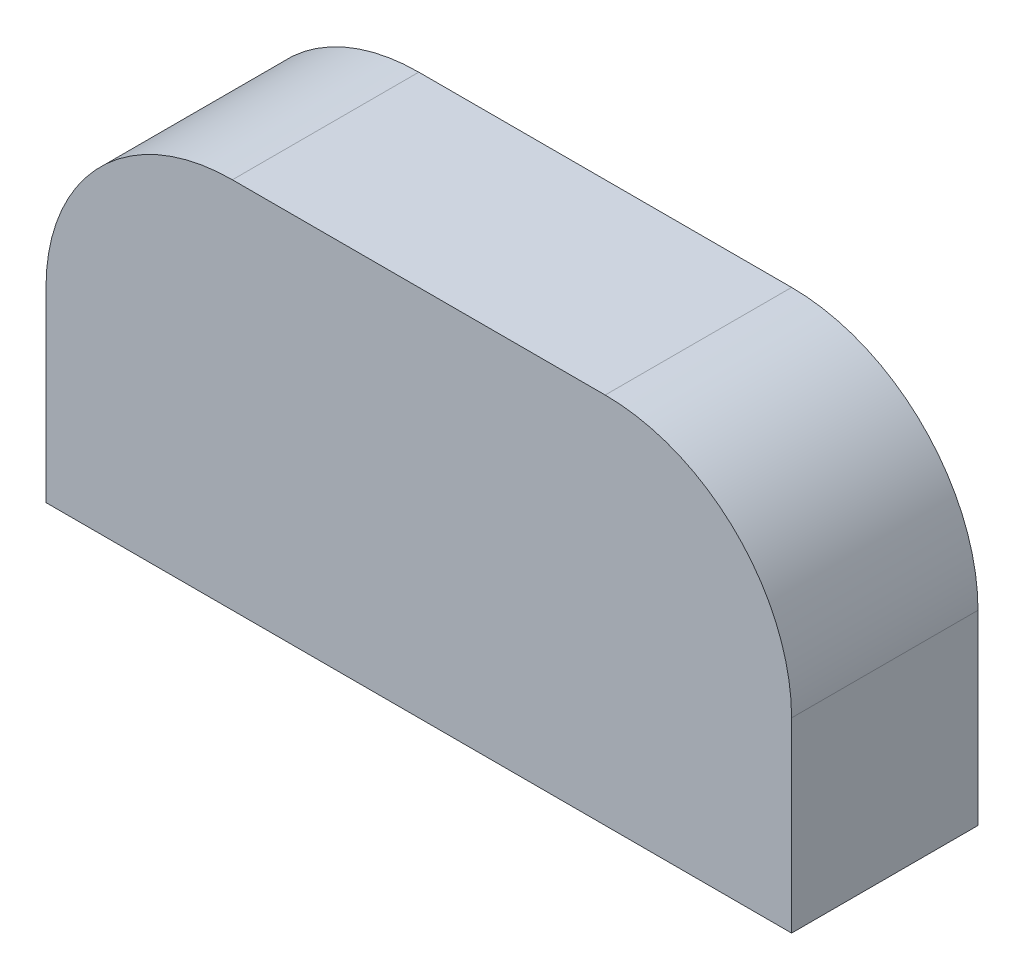
ISO-10303-21;
HEADER;
FILE_DESCRIPTION(('STEP AP214'),'2;1');
FILE_NAME('part.step','',(''),(''),'','','');
FILE_SCHEMA(('AUTOMOTIVE_DESIGN { 1 0 10303 214 1 1 1 1 }'));
ENDSEC;
DATA;
#1=APPLICATION_CONTEXT('core data for automotive mechanical design processes');
#2=APPLICATION_PROTOCOL_DEFINITION('international standard','automotive_design',2000,#1);
#3=PRODUCT_CONTEXT('',#1,'mechanical');
#4=PRODUCT('Part','Part','',(#3));
#5=PRODUCT_RELATED_PRODUCT_CATEGORY('part','',(#4));
#6=PRODUCT_DEFINITION_FORMATION('','',#4);
#7=PRODUCT_DEFINITION_CONTEXT('part definition',#1,'design');
#8=PRODUCT_DEFINITION('design','',#6,#7);
#9=PRODUCT_DEFINITION_SHAPE('','',#8);
#10=(LENGTH_UNIT() NAMED_UNIT(*) SI_UNIT(.MILLI.,.METRE.));
#11=(NAMED_UNIT(*) PLANE_ANGLE_UNIT() SI_UNIT($,.RADIAN.));
#12=(NAMED_UNIT(*) SI_UNIT($,.STERADIAN.) SOLID_ANGLE_UNIT());
#13=UNCERTAINTY_MEASURE_WITH_UNIT(LENGTH_MEASURE(1.E-05),#10,'distance_accuracy_value','');
#14=(GEOMETRIC_REPRESENTATION_CONTEXT(3) GLOBAL_UNCERTAINTY_ASSIGNED_CONTEXT((#13)) GLOBAL_UNIT_ASSIGNED_CONTEXT((#10,
#11,#12)) REPRESENTATION_CONTEXT('',''));
#15=CARTESIAN_POINT('',(0.,0.,0.));
#16=DIRECTION('',(0.,0.,1.));
#17=DIRECTION('',(1.,0.,0.));
#18=AXIS2_PLACEMENT_3D('',#15,#16,#17);
#19=CARTESIAN_POINT('',(12.7,6.35,6.35));
#20=DIRECTION('',(-1.,0.,0.));
#21=DIRECTION('',(0.,-1.,0.));
#22=AXIS2_PLACEMENT_3D('',#19,#20,#21);
#23=PLANE('',#22);
#24=DIRECTION('',(0.,1.,0.));
#25=VECTOR('',#24,1.);
#26=CARTESIAN_POINT('',(12.7,6.35,0.));
#27=LINE('',#26,#25);
#28=CARTESIAN_POINT('',(12.7,-6.35,0.));
#29=VERTEX_POINT('',#28);
#30=CARTESIAN_POINT('',(12.7,0.,0.));
#31=VERTEX_POINT('',#30);
#32=EDGE_CURVE('E125',#29,#31,#27,.T.);
#33=ORIENTED_EDGE('',*,*,#32,.T.);
#34=DIRECTION('',(0.,0.,-1.));
#35=VECTOR('',#34,1.);
#36=CARTESIAN_POINT('',(12.7,0.,6.35));
#37=LINE('',#36,#35);
#38=CARTESIAN_POINT('',(12.7,0.,6.35));
#39=VERTEX_POINT('',#38);
#40=EDGE_CURVE('E11',#31,#39,#37,.F.);
#41=ORIENTED_EDGE('',*,*,#40,.T.);
#42=DIRECTION('',(0.,1.,0.));
#43=VECTOR('',#42,1.);
#44=CARTESIAN_POINT('',(12.7,6.35,6.35));
#45=LINE('',#44,#43);
#46=CARTESIAN_POINT('',(12.7,-6.35,6.35));
#47=VERTEX_POINT('',#46);
#48=EDGE_CURVE('E135',#47,#39,#45,.T.);
#49=ORIENTED_EDGE('',*,*,#48,.F.);
#50=DIRECTION('',(0.,0.,-1.));
#51=VECTOR('',#50,1.);
#52=CARTESIAN_POINT('',(12.7,-6.35,6.35));
#53=LINE('',#52,#51);
#54=EDGE_CURVE('E115',#47,#29,#53,.T.);
#55=ORIENTED_EDGE('',*,*,#54,.T.);
#56=EDGE_LOOP('',(#33,#41,#49,#55));
#57=FACE_BOUND('',#56,.T.);
#58=ADVANCED_FACE('F38',(#57),#23,.F.);
#59=CARTESIAN_POINT('',(-12.7,6.35,6.35));
#60=DIRECTION('',(0.,-1.,0.));
#61=DIRECTION('',(0.,0.,-1.));
#62=AXIS2_PLACEMENT_3D('',#59,#60,#61);
#63=PLANE('',#62);
#64=DIRECTION('',(-1.,0.,0.));
#65=VECTOR('',#64,1.);
#66=CARTESIAN_POINT('',(-12.7,6.35,0.));
#67=LINE('',#66,#65);
#68=CARTESIAN_POINT('',(6.35,6.35,0.));
#69=VERTEX_POINT('',#68);
#70=CARTESIAN_POINT('',(-6.34999999999999,6.35,0.));
#71=VERTEX_POINT('',#70);
#72=EDGE_CURVE('E128',#69,#71,#67,.T.);
#73=ORIENTED_EDGE('',*,*,#72,.T.);
#74=DIRECTION('',(0.,0.,-1.));
#75=VECTOR('',#74,1.);
#76=CARTESIAN_POINT('',(-6.34999999999999,6.35,6.35));
#77=LINE('',#76,#75);
#78=CARTESIAN_POINT('',(-6.34999999999999,6.35,6.35));
#79=VERTEX_POINT('',#78);
#80=EDGE_CURVE('E60',#71,#79,#77,.F.);
#81=ORIENTED_EDGE('',*,*,#80,.T.);
#82=DIRECTION('',(-1.,0.,0.));
#83=VECTOR('',#82,1.);
#84=CARTESIAN_POINT('',(-12.7,6.35,6.35));
#85=LINE('',#84,#83);
#86=CARTESIAN_POINT('',(6.35,6.35,6.35));
#87=VERTEX_POINT('',#86);
#88=EDGE_CURVE('E104',#87,#79,#85,.T.);
#89=ORIENTED_EDGE('',*,*,#88,.F.);
#90=DIRECTION('',(0.,0.,-1.));
#91=VECTOR('',#90,1.);
#92=CARTESIAN_POINT('',(6.35,6.35,6.35));
#93=LINE('',#92,#91);
#94=EDGE_CURVE('E145',#87,#69,#93,.T.);
#95=ORIENTED_EDGE('',*,*,#94,.T.);
#96=EDGE_LOOP('',(#73,#81,#89,#95));
#97=FACE_BOUND('',#96,.T.);
#98=ADVANCED_FACE('F157',(#97),#63,.F.);
#99=CARTESIAN_POINT('',(-12.7,6.35,6.35));
#100=DIRECTION('',(1.,0.,0.));
#101=DIRECTION('',(0.,1.,0.));
#102=AXIS2_PLACEMENT_3D('',#99,#100,#101);
#103=PLANE('',#102);
#104=DIRECTION('',(0.,-1.,0.));
#105=VECTOR('',#104,1.);
#106=CARTESIAN_POINT('',(-12.7,6.35,6.35));
#107=LINE('',#106,#105);
#108=CARTESIAN_POINT('',(-12.7,0.,6.35));
#109=VERTEX_POINT('',#108);
#110=CARTESIAN_POINT('',(-12.7,-6.35,6.35));
#111=VERTEX_POINT('',#110);
#112=EDGE_CURVE('E93',#109,#111,#107,.T.);
#113=ORIENTED_EDGE('',*,*,#112,.F.);
#114=DIRECTION('',(0.,0.,-1.));
#115=VECTOR('',#114,1.);
#116=CARTESIAN_POINT('',(-12.7,0.,6.35));
#117=LINE('',#116,#115);
#118=CARTESIAN_POINT('',(-12.7,0.,0.));
#119=VERTEX_POINT('',#118);
#120=EDGE_CURVE('E114',#109,#119,#117,.T.);
#121=ORIENTED_EDGE('',*,*,#120,.T.);
#122=DIRECTION('',(0.,-1.,0.));
#123=VECTOR('',#122,1.);
#124=CARTESIAN_POINT('',(-12.7,6.35,0.));
#125=LINE('',#124,#123);
#126=CARTESIAN_POINT('',(-12.7,-6.35,0.));
#127=VERTEX_POINT('',#126);
#128=EDGE_CURVE('E110',#119,#127,#125,.T.);
#129=ORIENTED_EDGE('',*,*,#128,.T.);
#130=DIRECTION('',(0.,0.,-1.));
#131=VECTOR('',#130,1.);
#132=CARTESIAN_POINT('',(-12.7,-6.35,6.35));
#133=LINE('',#132,#131);
#134=EDGE_CURVE('E107',#111,#127,#133,.T.);
#135=ORIENTED_EDGE('',*,*,#134,.F.);
#136=EDGE_LOOP('',(#113,#121,#129,#135));
#137=FACE_BOUND('',#136,.T.);
#138=ADVANCED_FACE('F108',(#137),#103,.F.);
#139=CARTESIAN_POINT('',(-12.7,-6.35,6.35));
#140=DIRECTION('',(0.,1.,0.));
#141=DIRECTION('',(0.,0.,1.));
#142=AXIS2_PLACEMENT_3D('',#139,#140,#141);
#143=PLANE('',#142);
#144=DIRECTION('',(1.,0.,0.));
#145=VECTOR('',#144,1.);
#146=CARTESIAN_POINT('',(-12.7,-6.35,0.));
#147=LINE('',#146,#145);
#148=EDGE_CURVE('E133',#127,#29,#147,.T.);
#149=ORIENTED_EDGE('',*,*,#148,.T.);
#150=ORIENTED_EDGE('',*,*,#54,.F.);
#151=DIRECTION('',(1.,0.,0.));
#152=VECTOR('',#151,1.);
#153=CARTESIAN_POINT('',(-12.7,-6.35,6.35));
#154=LINE('',#153,#152);
#155=EDGE_CURVE('E97',#111,#47,#154,.T.);
#156=ORIENTED_EDGE('',*,*,#155,.F.);
#157=ORIENTED_EDGE('',*,*,#134,.T.);
#158=EDGE_LOOP('',(#149,#150,#156,#157));
#159=FACE_BOUND('',#158,.T.);
#160=ADVANCED_FACE('F117',(#159),#143,.F.);
#161=CARTESIAN_POINT('',(0.,0.,6.35));
#162=DIRECTION('',(0.,0.,1.));
#163=DIRECTION('',(1.,0.,0.));
#164=AXIS2_PLACEMENT_3D('',#161,#162,#163);
#165=PLANE('',#164);
#166=ORIENTED_EDGE('',*,*,#88,.T.);
#167=CARTESIAN_POINT('',(-6.34999999999999,0.,6.35));
#168=DIRECTION('',(0.,0.,1.));
#169=DIRECTION('',(1.,0.,0.));
#170=AXIS2_PLACEMENT_3D('',#167,#168,#169);
#171=CIRCLE('',#170,6.35);
#172=EDGE_CURVE('E47',#79,#109,#171,.T.);
#173=ORIENTED_EDGE('',*,*,#172,.T.);
#174=ORIENTED_EDGE('',*,*,#112,.T.);
#175=ORIENTED_EDGE('',*,*,#155,.T.);
#176=ORIENTED_EDGE('',*,*,#48,.T.);
#177=CARTESIAN_POINT('',(6.35,0.,6.35));
#178=DIRECTION('',(0.,0.,1.));
#179=DIRECTION('',(1.,0.,0.));
#180=AXIS2_PLACEMENT_3D('',#177,#178,#179);
#181=CIRCLE('',#180,6.35);
#182=EDGE_CURVE('E151',#39,#87,#181,.T.);
#183=ORIENTED_EDGE('',*,*,#182,.T.);
#184=EDGE_LOOP('',(#166,#173,#174,#175,#176,#183));
#185=FACE_BOUND('',#184,.T.);
#186=ADVANCED_FACE('F95',(#185),#165,.T.);
#187=CARTESIAN_POINT('',(0.,0.,0.));
#188=DIRECTION('',(0.,0.,1.));
#189=DIRECTION('',(1.,0.,0.));
#190=AXIS2_PLACEMENT_3D('',#187,#188,#189);
#191=PLANE('',#190);
#192=ORIENTED_EDGE('',*,*,#128,.F.);
#193=CARTESIAN_POINT('',(-6.34999999999999,0.,0.));
#194=DIRECTION('',(0.,0.,1.));
#195=DIRECTION('',(1.,0.,0.));
#196=AXIS2_PLACEMENT_3D('',#193,#194,#195);
#197=CIRCLE('',#196,6.35);
#198=EDGE_CURVE('E142',#119,#71,#197,.F.);
#199=ORIENTED_EDGE('',*,*,#198,.T.);
#200=ORIENTED_EDGE('',*,*,#72,.F.);
#201=CARTESIAN_POINT('',(6.35,0.,0.));
#202=DIRECTION('',(0.,0.,1.));
#203=DIRECTION('',(1.,0.,0.));
#204=AXIS2_PLACEMENT_3D('',#201,#202,#203);
#205=CIRCLE('',#204,6.35);
#206=EDGE_CURVE('E139',#69,#31,#205,.F.);
#207=ORIENTED_EDGE('',*,*,#206,.T.);
#208=ORIENTED_EDGE('',*,*,#32,.F.);
#209=ORIENTED_EDGE('',*,*,#148,.F.);
#210=EDGE_LOOP('',(#192,#199,#200,#207,#208,#209));
#211=FACE_BOUND('',#210,.T.);
#212=ADVANCED_FACE('F162',(#211),#191,.F.);
#213=CARTESIAN_POINT('',(-6.34999999999999,0.,6.35));
#214=DIRECTION('',(0.,0.,-1.));
#215=DIRECTION('',(-1.,0.,0.));
#216=AXIS2_PLACEMENT_3D('',#213,#214,#215);
#217=CYLINDRICAL_SURFACE('',#216,6.35);
#218=ORIENTED_EDGE('',*,*,#172,.F.);
#219=ORIENTED_EDGE('',*,*,#80,.F.);
#220=ORIENTED_EDGE('',*,*,#198,.F.);
#221=ORIENTED_EDGE('',*,*,#120,.F.);
#222=EDGE_LOOP('',(#218,#219,#220,#221));
#223=FACE_BOUND('',#222,.T.);
#224=ADVANCED_FACE('F172',(#223),#217,.T.);
#225=CARTESIAN_POINT('',(6.35,0.,6.35));
#226=DIRECTION('',(0.,0.,-1.));
#227=DIRECTION('',(-1.,0.,0.));
#228=AXIS2_PLACEMENT_3D('',#225,#226,#227);
#229=CYLINDRICAL_SURFACE('',#228,6.35);
#230=ORIENTED_EDGE('',*,*,#182,.F.);
#231=ORIENTED_EDGE('',*,*,#40,.F.);
#232=ORIENTED_EDGE('',*,*,#206,.F.);
#233=ORIENTED_EDGE('',*,*,#94,.F.);
#234=EDGE_LOOP('',(#230,#231,#232,#233));
#235=FACE_BOUND('',#234,.T.);
#236=ADVANCED_FACE('F40',(#235),#229,.T.);
#237=CLOSED_SHELL('',(#58,#98,#138,#160,#186,#212,#224,#236));
#238=MANIFOLD_SOLID_BREP('B2',#237);
#239=ADVANCED_BREP_SHAPE_REPRESENTATION('',(#18,#238),#14);
#240=SHAPE_DEFINITION_REPRESENTATION(#9,#239);
ENDSEC;
END-ISO-10303-21;
